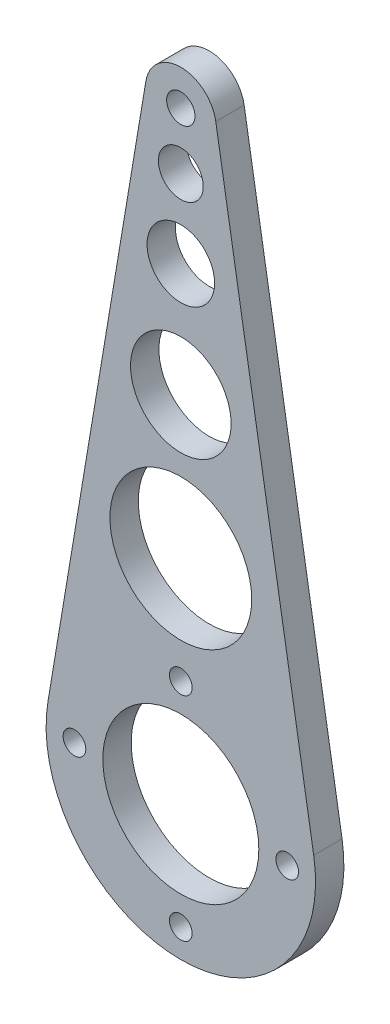
ISO-10303-21;
HEADER;
FILE_DESCRIPTION(('STEP AP214'),'2;1');
FILE_NAME('part.step','',(''),(''),'','','');
FILE_SCHEMA(('AUTOMOTIVE_DESIGN { 1 0 10303 214 1 1 1 1 }'));
ENDSEC;
DATA;
#1=APPLICATION_CONTEXT('core data for automotive mechanical design processes');
#2=APPLICATION_PROTOCOL_DEFINITION('international standard','automotive_design',2000,#1);
#3=PRODUCT_CONTEXT('',#1,'mechanical');
#4=PRODUCT('Part','Part','',(#3));
#5=PRODUCT_RELATED_PRODUCT_CATEGORY('part','',(#4));
#6=PRODUCT_DEFINITION_FORMATION('','',#4);
#7=PRODUCT_DEFINITION_CONTEXT('part definition',#1,'design');
#8=PRODUCT_DEFINITION('design','',#6,#7);
#9=PRODUCT_DEFINITION_SHAPE('','',#8);
#10=(LENGTH_UNIT() NAMED_UNIT(*) SI_UNIT(.MILLI.,.METRE.));
#11=(NAMED_UNIT(*) PLANE_ANGLE_UNIT() SI_UNIT($,.RADIAN.));
#12=(NAMED_UNIT(*) SI_UNIT($,.STERADIAN.) SOLID_ANGLE_UNIT());
#13=UNCERTAINTY_MEASURE_WITH_UNIT(LENGTH_MEASURE(1.E-05),#10,'distance_accuracy_value','');
#14=(GEOMETRIC_REPRESENTATION_CONTEXT(3) GLOBAL_UNCERTAINTY_ASSIGNED_CONTEXT((#13)) GLOBAL_UNIT_ASSIGNED_CONTEXT((#10,
#11,#12)) REPRESENTATION_CONTEXT('',''));
#15=CARTESIAN_POINT('',(0.,0.,0.));
#16=DIRECTION('',(0.,0.,1.));
#17=DIRECTION('',(1.,0.,0.));
#18=AXIS2_PLACEMENT_3D('',#15,#16,#17);
#19=CARTESIAN_POINT('',(0.,0.,4.));
#20=DIRECTION('',(0.,0.,1.));
#21=DIRECTION('',(1.,0.,0.));
#22=AXIS2_PLACEMENT_3D('',#19,#20,#21);
#23=PLANE('',#22);
#24=CARTESIAN_POINT('',(0.,50.,4.));
#25=DIRECTION('',(0.,0.,1.));
#26=DIRECTION('',(1.,0.,0.));
#27=AXIS2_PLACEMENT_3D('',#24,#25,#26);
#28=CIRCLE('',#27,7.09090909090909);
#29=CARTESIAN_POINT('',(7.09090909090909,50.,4.));
#30=VERTEX_POINT('',#29);
#31=EDGE_CURVE('E157',#30,#30,#28,.T.);
#32=ORIENTED_EDGE('',*,*,#31,.F.);
#33=EDGE_LOOP('',(#32));
#34=FACE_BOUND('',#33,.T.);
#35=CARTESIAN_POINT('',(0.,77.,4.));
#36=DIRECTION('',(0.,0.,1.));
#37=DIRECTION('',(1.,0.,0.));
#38=AXIS2_PLACEMENT_3D('',#35,#36,#37);
#39=CIRCLE('',#38,3.16363636363636);
#40=CARTESIAN_POINT('',(3.16363636363636,77.,4.));
#41=VERTEX_POINT('',#40);
#42=EDGE_CURVE('E145',#41,#41,#39,.T.);
#43=ORIENTED_EDGE('',*,*,#42,.F.);
#44=EDGE_LOOP('',(#43));
#45=FACE_BOUND('',#44,.T.);
#46=CARTESIAN_POINT('',(8.48977342514678E-13,-15.,4.));
#47=DIRECTION('',(0.,0.,1.));
#48=DIRECTION('',(1.,0.,0.));
#49=AXIS2_PLACEMENT_3D('',#46,#47,#48);
#50=CIRCLE('',#49,1.60000000000091);
#51=CARTESIAN_POINT('',(1.60000000000176,-15.,4.));
#52=VERTEX_POINT('',#51);
#53=EDGE_CURVE('E133',#52,#52,#50,.T.);
#54=ORIENTED_EDGE('',*,*,#53,.F.);
#55=EDGE_LOOP('',(#54));
#56=FACE_BOUND('',#55,.T.);
#57=CARTESIAN_POINT('',(0.,85.,4.));
#58=DIRECTION('',(0.,0.,1.));
#59=DIRECTION('',(1.,0.,0.));
#60=AXIS2_PLACEMENT_3D('',#57,#58,#59);
#61=CIRCLE('',#60,2.);
#62=CARTESIAN_POINT('',(2.,85.,4.));
#63=VERTEX_POINT('',#62);
#64=EDGE_CURVE('E121',#63,#63,#61,.T.);
#65=ORIENTED_EDGE('',*,*,#64,.F.);
#66=EDGE_LOOP('',(#65));
#67=FACE_BOUND('',#66,.T.);
#68=CARTESIAN_POINT('',(0.,15.,4.));
#69=DIRECTION('',(0.,0.,1.));
#70=DIRECTION('',(1.,0.,0.));
#71=AXIS2_PLACEMENT_3D('',#68,#69,#70);
#72=CIRCLE('',#71,1.6);
#73=CARTESIAN_POINT('',(1.6,15.,4.));
#74=VERTEX_POINT('',#73);
#75=EDGE_CURVE('E100',#74,#74,#72,.T.);
#76=ORIENTED_EDGE('',*,*,#75,.F.);
#77=EDGE_LOOP('',(#76));
#78=FACE_BOUND('',#77,.T.);
#79=CARTESIAN_POINT('',(0.,0.,4.));
#80=DIRECTION('',(0.,0.,1.));
#81=DIRECTION('',(1.,0.,0.));
#82=AXIS2_PLACEMENT_3D('',#79,#80,#81);
#83=CIRCLE('',#82,19.);
#84=CARTESIAN_POINT('',(-18.7405117861525,3.12941176470588,4.));
#85=VERTEX_POINT('',#84);
#86=CARTESIAN_POINT('',(18.7405117861525,3.12941176470588,4.));
#87=VERTEX_POINT('',#86);
#88=EDGE_CURVE('E85',#85,#87,#83,.T.);
#89=ORIENTED_EDGE('',*,*,#88,.T.);
#90=DIRECTION('',(-0.164705882352941,0.986342725586973,0.));
#91=VECTOR('',#90,1.);
#92=CARTESIAN_POINT('',(18.7405117861525,3.12941176470588,4.));
#93=LINE('',#92,#91);
#94=CARTESIAN_POINT('',(4.93171362793486,85.8235294117647,4.));
#95=VERTEX_POINT('',#94);
#96=EDGE_CURVE('E80',#87,#95,#93,.T.);
#97=ORIENTED_EDGE('',*,*,#96,.T.);
#98=CARTESIAN_POINT('',(0.,85.,4.));
#99=DIRECTION('',(0.,0.,1.));
#100=DIRECTION('',(1.,0.,0.));
#101=AXIS2_PLACEMENT_3D('',#98,#99,#100);
#102=CIRCLE('',#101,5.);
#103=CARTESIAN_POINT('',(-4.93171362793486,85.8235294117647,4.));
#104=VERTEX_POINT('',#103);
#105=EDGE_CURVE('E83',#95,#104,#102,.T.);
#106=ORIENTED_EDGE('',*,*,#105,.T.);
#107=DIRECTION('',(-0.164705882352941,-0.986342725586973,0.));
#108=VECTOR('',#107,1.);
#109=CARTESIAN_POINT('',(-18.7405117861525,3.12941176470588,4.));
#110=LINE('',#109,#108);
#111=EDGE_CURVE('E50',#104,#85,#110,.T.);
#112=ORIENTED_EDGE('',*,*,#111,.T.);
#113=EDGE_LOOP('',(#89,#97,#106,#112));
#114=FACE_BOUND('',#113,.T.);
#115=CARTESIAN_POINT('',(0.,0.,4.));
#116=DIRECTION('',(0.,0.,1.));
#117=DIRECTION('',(1.,0.,0.));
#118=AXIS2_PLACEMENT_3D('',#115,#116,#117);
#119=CIRCLE('',#118,11.);
#120=CARTESIAN_POINT('',(11.,0.,4.));
#121=VERTEX_POINT('',#120);
#122=EDGE_CURVE('E115',#121,#121,#119,.T.);
#123=ORIENTED_EDGE('',*,*,#122,.F.);
#124=EDGE_LOOP('',(#123));
#125=FACE_BOUND('',#124,.T.);
#126=CARTESIAN_POINT('',(15.0000000000004,4.24488671257339E-13,4.));
#127=DIRECTION('',(0.,0.,1.));
#128=DIRECTION('',(1.,0.,0.));
#129=AXIS2_PLACEMENT_3D('',#126,#127,#128);
#130=CIRCLE('',#129,1.60000000000033);
#131=CARTESIAN_POINT('',(16.6000000000008,4.24488671257339E-13,4.));
#132=VERTEX_POINT('',#131);
#133=EDGE_CURVE('E127',#132,#132,#130,.T.);
#134=ORIENTED_EDGE('',*,*,#133,.F.);
#135=EDGE_LOOP('',(#134));
#136=FACE_BOUND('',#135,.T.);
#137=CARTESIAN_POINT('',(-14.9999999999996,-4.2632564145606E-13,4.));
#138=DIRECTION('',(0.,0.,1.));
#139=DIRECTION('',(1.,0.,0.));
#140=AXIS2_PLACEMENT_3D('',#137,#138,#139);
#141=CIRCLE('',#140,1.60000000000068);
#142=CARTESIAN_POINT('',(-13.3999999999989,-4.2632564145606E-13,4.));
#143=VERTEX_POINT('',#142);
#144=EDGE_CURVE('E139',#143,#143,#141,.T.);
#145=ORIENTED_EDGE('',*,*,#144,.F.);
#146=EDGE_LOOP('',(#145));
#147=FACE_BOUND('',#146,.T.);
#148=CARTESIAN_POINT('',(0.,30.,4.));
#149=DIRECTION('',(0.,0.,1.));
#150=DIRECTION('',(1.,0.,0.));
#151=AXIS2_PLACEMENT_3D('',#148,#149,#150);
#152=CIRCLE('',#151,10.);
#153=CARTESIAN_POINT('',(10.,30.,4.));
#154=VERTEX_POINT('',#153);
#155=EDGE_CURVE('E151',#154,#154,#152,.T.);
#156=ORIENTED_EDGE('',*,*,#155,.F.);
#157=EDGE_LOOP('',(#156));
#158=FACE_BOUND('',#157,.T.);
#159=CARTESIAN_POINT('',(0.,66.,4.));
#160=DIRECTION('',(0.,0.,1.));
#161=DIRECTION('',(1.,0.,0.));
#162=AXIS2_PLACEMENT_3D('',#159,#160,#161);
#163=CIRCLE('',#162,4.76363636363637);
#164=CARTESIAN_POINT('',(4.76363636363637,66.,4.));
#165=VERTEX_POINT('',#164);
#166=EDGE_CURVE('E163',#165,#165,#163,.T.);
#167=ORIENTED_EDGE('',*,*,#166,.F.);
#168=EDGE_LOOP('',(#167));
#169=FACE_BOUND('',#168,.T.);
#170=ADVANCED_FACE('F33',(#34,#45,#56,#67,#78,#114,#125,#136,#147,#158,#169),#23,.T.);
#171=CARTESIAN_POINT('',(0.,0.,0.));
#172=DIRECTION('',(0.,0.,1.));
#173=DIRECTION('',(1.,0.,0.));
#174=AXIS2_PLACEMENT_3D('',#171,#172,#173);
#175=PLANE('',#174);
#176=CARTESIAN_POINT('',(0.,0.,0.));
#177=DIRECTION('',(0.,0.,1.));
#178=DIRECTION('',(1.,0.,0.));
#179=AXIS2_PLACEMENT_3D('',#176,#177,#178);
#180=CIRCLE('',#179,19.);
#181=CARTESIAN_POINT('',(-18.7405117861525,3.12941176470588,0.));
#182=VERTEX_POINT('',#181);
#183=CARTESIAN_POINT('',(18.7405117861525,3.12941176470588,0.));
#184=VERTEX_POINT('',#183);
#185=EDGE_CURVE('E97',#182,#184,#180,.T.);
#186=ORIENTED_EDGE('',*,*,#185,.F.);
#187=DIRECTION('',(-0.164705882352941,-0.986342725586973,0.));
#188=VECTOR('',#187,1.);
#189=CARTESIAN_POINT('',(-18.7405117861525,3.12941176470588,0.));
#190=LINE('',#189,#188);
#191=CARTESIAN_POINT('',(-4.93171362793486,85.8235294117647,0.));
#192=VERTEX_POINT('',#191);
#193=EDGE_CURVE('E73',#192,#182,#190,.T.);
#194=ORIENTED_EDGE('',*,*,#193,.F.);
#195=CARTESIAN_POINT('',(0.,85.,0.));
#196=DIRECTION('',(0.,0.,1.));
#197=DIRECTION('',(1.,0.,0.));
#198=AXIS2_PLACEMENT_3D('',#195,#196,#197);
#199=CIRCLE('',#198,5.);
#200=CARTESIAN_POINT('',(4.93171362793486,85.8235294117647,0.));
#201=VERTEX_POINT('',#200);
#202=EDGE_CURVE('E67',#201,#192,#199,.T.);
#203=ORIENTED_EDGE('',*,*,#202,.F.);
#204=DIRECTION('',(-0.164705882352941,0.986342725586973,0.));
#205=VECTOR('',#204,1.);
#206=CARTESIAN_POINT('',(18.7405117861525,3.12941176470588,0.));
#207=LINE('',#206,#205);
#208=EDGE_CURVE('E89',#184,#201,#207,.T.);
#209=ORIENTED_EDGE('',*,*,#208,.F.);
#210=EDGE_LOOP('',(#186,#194,#203,#209));
#211=FACE_BOUND('',#210,.T.);
#212=CARTESIAN_POINT('',(0.,15.,0.));
#213=DIRECTION('',(0.,0.,1.));
#214=DIRECTION('',(1.,0.,0.));
#215=AXIS2_PLACEMENT_3D('',#212,#213,#214);
#216=CIRCLE('',#215,1.6);
#217=CARTESIAN_POINT('',(1.6,15.,0.));
#218=VERTEX_POINT('',#217);
#219=EDGE_CURVE('E112',#218,#218,#216,.T.);
#220=ORIENTED_EDGE('',*,*,#219,.T.);
#221=EDGE_LOOP('',(#220));
#222=FACE_BOUND('',#221,.T.);
#223=CARTESIAN_POINT('',(0.,0.,0.));
#224=DIRECTION('',(0.,0.,1.));
#225=DIRECTION('',(1.,0.,0.));
#226=AXIS2_PLACEMENT_3D('',#223,#224,#225);
#227=CIRCLE('',#226,11.);
#228=CARTESIAN_POINT('',(11.,0.,0.));
#229=VERTEX_POINT('',#228);
#230=EDGE_CURVE('E118',#229,#229,#227,.T.);
#231=ORIENTED_EDGE('',*,*,#230,.T.);
#232=EDGE_LOOP('',(#231));
#233=FACE_BOUND('',#232,.T.);
#234=CARTESIAN_POINT('',(0.,85.,0.));
#235=DIRECTION('',(0.,0.,1.));
#236=DIRECTION('',(1.,0.,0.));
#237=AXIS2_PLACEMENT_3D('',#234,#235,#236);
#238=CIRCLE('',#237,2.);
#239=CARTESIAN_POINT('',(2.,85.,0.));
#240=VERTEX_POINT('',#239);
#241=EDGE_CURVE('E124',#240,#240,#238,.T.);
#242=ORIENTED_EDGE('',*,*,#241,.T.);
#243=EDGE_LOOP('',(#242));
#244=FACE_BOUND('',#243,.T.);
#245=CARTESIAN_POINT('',(15.0000000000004,4.24488671257339E-13,0.));
#246=DIRECTION('',(0.,0.,1.));
#247=DIRECTION('',(1.,0.,0.));
#248=AXIS2_PLACEMENT_3D('',#245,#246,#247);
#249=CIRCLE('',#248,1.60000000000033);
#250=CARTESIAN_POINT('',(16.6000000000008,4.24488671257339E-13,0.));
#251=VERTEX_POINT('',#250);
#252=EDGE_CURVE('E130',#251,#251,#249,.T.);
#253=ORIENTED_EDGE('',*,*,#252,.T.);
#254=EDGE_LOOP('',(#253));
#255=FACE_BOUND('',#254,.T.);
#256=CARTESIAN_POINT('',(8.48977342514678E-13,-15.,0.));
#257=DIRECTION('',(0.,0.,1.));
#258=DIRECTION('',(1.,0.,0.));
#259=AXIS2_PLACEMENT_3D('',#256,#257,#258);
#260=CIRCLE('',#259,1.60000000000091);
#261=CARTESIAN_POINT('',(1.60000000000176,-15.,0.));
#262=VERTEX_POINT('',#261);
#263=EDGE_CURVE('E136',#262,#262,#260,.T.);
#264=ORIENTED_EDGE('',*,*,#263,.T.);
#265=EDGE_LOOP('',(#264));
#266=FACE_BOUND('',#265,.T.);
#267=CARTESIAN_POINT('',(-14.9999999999996,-4.2632564145606E-13,0.));
#268=DIRECTION('',(0.,0.,1.));
#269=DIRECTION('',(1.,0.,0.));
#270=AXIS2_PLACEMENT_3D('',#267,#268,#269);
#271=CIRCLE('',#270,1.60000000000068);
#272=CARTESIAN_POINT('',(-13.3999999999989,-4.2632564145606E-13,0.));
#273=VERTEX_POINT('',#272);
#274=EDGE_CURVE('E142',#273,#273,#271,.T.);
#275=ORIENTED_EDGE('',*,*,#274,.T.);
#276=EDGE_LOOP('',(#275));
#277=FACE_BOUND('',#276,.T.);
#278=CARTESIAN_POINT('',(0.,77.,0.));
#279=DIRECTION('',(0.,0.,1.));
#280=DIRECTION('',(1.,0.,0.));
#281=AXIS2_PLACEMENT_3D('',#278,#279,#280);
#282=CIRCLE('',#281,3.16363636363636);
#283=CARTESIAN_POINT('',(3.16363636363636,77.,0.));
#284=VERTEX_POINT('',#283);
#285=EDGE_CURVE('E148',#284,#284,#282,.T.);
#286=ORIENTED_EDGE('',*,*,#285,.T.);
#287=EDGE_LOOP('',(#286));
#288=FACE_BOUND('',#287,.T.);
#289=CARTESIAN_POINT('',(0.,30.,0.));
#290=DIRECTION('',(0.,0.,1.));
#291=DIRECTION('',(1.,0.,0.));
#292=AXIS2_PLACEMENT_3D('',#289,#290,#291);
#293=CIRCLE('',#292,10.);
#294=CARTESIAN_POINT('',(10.,30.,0.));
#295=VERTEX_POINT('',#294);
#296=EDGE_CURVE('E154',#295,#295,#293,.T.);
#297=ORIENTED_EDGE('',*,*,#296,.T.);
#298=EDGE_LOOP('',(#297));
#299=FACE_BOUND('',#298,.T.);
#300=CARTESIAN_POINT('',(0.,50.,0.));
#301=DIRECTION('',(0.,0.,1.));
#302=DIRECTION('',(1.,0.,0.));
#303=AXIS2_PLACEMENT_3D('',#300,#301,#302);
#304=CIRCLE('',#303,7.09090909090909);
#305=CARTESIAN_POINT('',(7.09090909090909,50.,0.));
#306=VERTEX_POINT('',#305);
#307=EDGE_CURVE('E160',#306,#306,#304,.T.);
#308=ORIENTED_EDGE('',*,*,#307,.T.);
#309=EDGE_LOOP('',(#308));
#310=FACE_BOUND('',#309,.T.);
#311=CARTESIAN_POINT('',(0.,66.,0.));
#312=DIRECTION('',(0.,0.,1.));
#313=DIRECTION('',(1.,0.,0.));
#314=AXIS2_PLACEMENT_3D('',#311,#312,#313);
#315=CIRCLE('',#314,4.76363636363637);
#316=CARTESIAN_POINT('',(4.76363636363637,66.,0.));
#317=VERTEX_POINT('',#316);
#318=EDGE_CURVE('E166',#317,#317,#315,.T.);
#319=ORIENTED_EDGE('',*,*,#318,.T.);
#320=EDGE_LOOP('',(#319));
#321=FACE_BOUND('',#320,.T.);
#322=ADVANCED_FACE('F108',(#211,#222,#233,#244,#255,#266,#277,#288,#299,#310,#321),#175,.F.);
#323=CARTESIAN_POINT('',(0.,0.,4.));
#324=DIRECTION('',(0.,0.,-1.));
#325=DIRECTION('',(-1.,0.,0.));
#326=AXIS2_PLACEMENT_3D('',#323,#324,#325);
#327=CYLINDRICAL_SURFACE('',#326,19.);
#328=ORIENTED_EDGE('',*,*,#185,.T.);
#329=DIRECTION('',(0.,0.,-1.));
#330=VECTOR('',#329,1.);
#331=CARTESIAN_POINT('',(18.7405117861525,3.12941176470588,4.));
#332=LINE('',#331,#330);
#333=EDGE_CURVE('E11',#87,#184,#332,.T.);
#334=ORIENTED_EDGE('',*,*,#333,.F.);
#335=ORIENTED_EDGE('',*,*,#88,.F.);
#336=DIRECTION('',(0.,0.,-1.));
#337=VECTOR('',#336,1.);
#338=CARTESIAN_POINT('',(-18.7405117861525,3.12941176470588,4.));
#339=LINE('',#338,#337);
#340=EDGE_CURVE('E93',#85,#182,#339,.T.);
#341=ORIENTED_EDGE('',*,*,#340,.T.);
#342=EDGE_LOOP('',(#328,#334,#335,#341));
#343=FACE_BOUND('',#342,.T.);
#344=ADVANCED_FACE('F35',(#343),#327,.T.);
#345=CARTESIAN_POINT('',(18.7405117861525,3.12941176470588,4.));
#346=DIRECTION('',(-0.986342725586973,-0.164705882352941,0.));
#347=DIRECTION('',(0.164705882352941,-0.986342725586973,0.));
#348=AXIS2_PLACEMENT_3D('',#345,#346,#347);
#349=PLANE('',#348);
#350=ORIENTED_EDGE('',*,*,#208,.T.);
#351=DIRECTION('',(0.,0.,-1.));
#352=VECTOR('',#351,1.);
#353=CARTESIAN_POINT('',(4.93171362793486,85.8235294117647,4.));
#354=LINE('',#353,#352);
#355=EDGE_CURVE('E42',#95,#201,#354,.T.);
#356=ORIENTED_EDGE('',*,*,#355,.F.);
#357=ORIENTED_EDGE('',*,*,#96,.F.);
#358=ORIENTED_EDGE('',*,*,#333,.T.);
#359=EDGE_LOOP('',(#350,#356,#357,#358));
#360=FACE_BOUND('',#359,.T.);
#361=ADVANCED_FACE('F88',(#360),#349,.F.);
#362=CARTESIAN_POINT('',(0.,85.,4.));
#363=DIRECTION('',(0.,0.,-1.));
#364=DIRECTION('',(-1.,0.,0.));
#365=AXIS2_PLACEMENT_3D('',#362,#363,#364);
#366=CYLINDRICAL_SURFACE('',#365,5.);
#367=ORIENTED_EDGE('',*,*,#202,.T.);
#368=DIRECTION('',(0.,0.,-1.));
#369=VECTOR('',#368,1.);
#370=CARTESIAN_POINT('',(-4.93171362793486,85.8235294117647,4.));
#371=LINE('',#370,#369);
#372=EDGE_CURVE('E90',#104,#192,#371,.T.);
#373=ORIENTED_EDGE('',*,*,#372,.F.);
#374=ORIENTED_EDGE('',*,*,#105,.F.);
#375=ORIENTED_EDGE('',*,*,#355,.T.);
#376=EDGE_LOOP('',(#367,#373,#374,#375));
#377=FACE_BOUND('',#376,.T.);
#378=ADVANCED_FACE('F91',(#377),#366,.T.);
#379=CARTESIAN_POINT('',(-18.7405117861525,3.12941176470588,4.));
#380=DIRECTION('',(0.986342725586973,-0.164705882352941,0.));
#381=DIRECTION('',(0.164705882352941,0.986342725586973,0.));
#382=AXIS2_PLACEMENT_3D('',#379,#380,#381);
#383=PLANE('',#382);
#384=ORIENTED_EDGE('',*,*,#193,.T.);
#385=ORIENTED_EDGE('',*,*,#340,.F.);
#386=ORIENTED_EDGE('',*,*,#111,.F.);
#387=ORIENTED_EDGE('',*,*,#372,.T.);
#388=EDGE_LOOP('',(#384,#385,#386,#387));
#389=FACE_BOUND('',#388,.T.);
#390=ADVANCED_FACE('F105',(#389),#383,.F.);
#391=CARTESIAN_POINT('',(0.,15.,4.));
#392=DIRECTION('',(0.,0.,-1.));
#393=DIRECTION('',(-1.,0.,0.));
#394=AXIS2_PLACEMENT_3D('',#391,#392,#393);
#395=CYLINDRICAL_SURFACE('',#394,1.6);
#396=ORIENTED_EDGE('',*,*,#75,.T.);
#397=EDGE_LOOP('',(#396));
#398=FACE_BOUND('',#397,.T.);
#399=ORIENTED_EDGE('',*,*,#219,.F.);
#400=EDGE_LOOP('',(#399));
#401=FACE_BOUND('',#400,.T.);
#402=ADVANCED_FACE('F185',(#398,#401),#395,.F.);
#403=CARTESIAN_POINT('',(0.,0.,4.));
#404=DIRECTION('',(0.,0.,-1.));
#405=DIRECTION('',(-1.,0.,0.));
#406=AXIS2_PLACEMENT_3D('',#403,#404,#405);
#407=CYLINDRICAL_SURFACE('',#406,11.);
#408=ORIENTED_EDGE('',*,*,#122,.T.);
#409=EDGE_LOOP('',(#408));
#410=FACE_BOUND('',#409,.T.);
#411=ORIENTED_EDGE('',*,*,#230,.F.);
#412=EDGE_LOOP('',(#411));
#413=FACE_BOUND('',#412,.T.);
#414=ADVANCED_FACE('F231',(#410,#413),#407,.F.);
#415=CARTESIAN_POINT('',(0.,85.,4.));
#416=DIRECTION('',(0.,0.,-1.));
#417=DIRECTION('',(-1.,0.,0.));
#418=AXIS2_PLACEMENT_3D('',#415,#416,#417);
#419=CYLINDRICAL_SURFACE('',#418,2.);
#420=ORIENTED_EDGE('',*,*,#64,.T.);
#421=EDGE_LOOP('',(#420));
#422=FACE_BOUND('',#421,.T.);
#423=ORIENTED_EDGE('',*,*,#241,.F.);
#424=EDGE_LOOP('',(#423));
#425=FACE_BOUND('',#424,.T.);
#426=ADVANCED_FACE('F239',(#422,#425),#419,.F.);
#427=CARTESIAN_POINT('',(15.0000000000004,4.24488671257339E-13,4.));
#428=DIRECTION('',(0.,0.,-1.));
#429=DIRECTION('',(-1.,0.,0.));
#430=AXIS2_PLACEMENT_3D('',#427,#428,#429);
#431=CYLINDRICAL_SURFACE('',#430,1.60000000000033);
#432=ORIENTED_EDGE('',*,*,#133,.T.);
#433=EDGE_LOOP('',(#432));
#434=FACE_BOUND('',#433,.T.);
#435=ORIENTED_EDGE('',*,*,#252,.F.);
#436=EDGE_LOOP('',(#435));
#437=FACE_BOUND('',#436,.T.);
#438=ADVANCED_FACE('F247',(#434,#437),#431,.F.);
#439=CARTESIAN_POINT('',(8.48977342514678E-13,-15.,4.));
#440=DIRECTION('',(0.,0.,-1.));
#441=DIRECTION('',(-1.,0.,0.));
#442=AXIS2_PLACEMENT_3D('',#439,#440,#441);
#443=CYLINDRICAL_SURFACE('',#442,1.60000000000091);
#444=ORIENTED_EDGE('',*,*,#53,.T.);
#445=EDGE_LOOP('',(#444));
#446=FACE_BOUND('',#445,.T.);
#447=ORIENTED_EDGE('',*,*,#263,.F.);
#448=EDGE_LOOP('',(#447));
#449=FACE_BOUND('',#448,.T.);
#450=ADVANCED_FACE('F256',(#446,#449),#443,.F.);
#451=CARTESIAN_POINT('',(-14.9999999999996,-4.2632564145606E-13,4.));
#452=DIRECTION('',(0.,0.,-1.));
#453=DIRECTION('',(-1.,0.,0.));
#454=AXIS2_PLACEMENT_3D('',#451,#452,#453);
#455=CYLINDRICAL_SURFACE('',#454,1.60000000000068);
#456=ORIENTED_EDGE('',*,*,#144,.T.);
#457=EDGE_LOOP('',(#456));
#458=FACE_BOUND('',#457,.T.);
#459=ORIENTED_EDGE('',*,*,#274,.F.);
#460=EDGE_LOOP('',(#459));
#461=FACE_BOUND('',#460,.T.);
#462=ADVANCED_FACE('F265',(#458,#461),#455,.F.);
#463=CARTESIAN_POINT('',(0.,77.,4.));
#464=DIRECTION('',(0.,0.,-1.));
#465=DIRECTION('',(-1.,0.,0.));
#466=AXIS2_PLACEMENT_3D('',#463,#464,#465);
#467=CYLINDRICAL_SURFACE('',#466,3.16363636363636);
#468=ORIENTED_EDGE('',*,*,#42,.T.);
#469=EDGE_LOOP('',(#468));
#470=FACE_BOUND('',#469,.T.);
#471=ORIENTED_EDGE('',*,*,#285,.F.);
#472=EDGE_LOOP('',(#471));
#473=FACE_BOUND('',#472,.T.);
#474=ADVANCED_FACE('F274',(#470,#473),#467,.F.);
#475=CARTESIAN_POINT('',(0.,30.,4.));
#476=DIRECTION('',(0.,0.,-1.));
#477=DIRECTION('',(-1.,0.,0.));
#478=AXIS2_PLACEMENT_3D('',#475,#476,#477);
#479=CYLINDRICAL_SURFACE('',#478,10.);
#480=ORIENTED_EDGE('',*,*,#155,.T.);
#481=EDGE_LOOP('',(#480));
#482=FACE_BOUND('',#481,.T.);
#483=ORIENTED_EDGE('',*,*,#296,.F.);
#484=EDGE_LOOP('',(#483));
#485=FACE_BOUND('',#484,.T.);
#486=ADVANCED_FACE('F283',(#482,#485),#479,.F.);
#487=CARTESIAN_POINT('',(0.,50.,4.));
#488=DIRECTION('',(0.,0.,-1.));
#489=DIRECTION('',(-1.,0.,0.));
#490=AXIS2_PLACEMENT_3D('',#487,#488,#489);
#491=CYLINDRICAL_SURFACE('',#490,7.09090909090909);
#492=ORIENTED_EDGE('',*,*,#31,.T.);
#493=EDGE_LOOP('',(#492));
#494=FACE_BOUND('',#493,.T.);
#495=ORIENTED_EDGE('',*,*,#307,.F.);
#496=EDGE_LOOP('',(#495));
#497=FACE_BOUND('',#496,.T.);
#498=ADVANCED_FACE('F292',(#494,#497),#491,.F.);
#499=CARTESIAN_POINT('',(0.,66.,4.));
#500=DIRECTION('',(0.,0.,-1.));
#501=DIRECTION('',(-1.,0.,0.));
#502=AXIS2_PLACEMENT_3D('',#499,#500,#501);
#503=CYLINDRICAL_SURFACE('',#502,4.76363636363637);
#504=ORIENTED_EDGE('',*,*,#166,.T.);
#505=EDGE_LOOP('',(#504));
#506=FACE_BOUND('',#505,.T.);
#507=ORIENTED_EDGE('',*,*,#318,.F.);
#508=EDGE_LOOP('',(#507));
#509=FACE_BOUND('',#508,.T.);
#510=ADVANCED_FACE('F172',(#506,#509),#503,.F.);
#511=CLOSED_SHELL('',(#170,#322,#344,#361,#378,#390,#402,#414,#426,#438,#450,#462,#474,#486,
#498,#510));
#512=MANIFOLD_SOLID_BREP('B2',#511);
#513=ADVANCED_BREP_SHAPE_REPRESENTATION('',(#18,#512),#14);
#514=SHAPE_DEFINITION_REPRESENTATION(#9,#513);
ENDSEC;
END-ISO-10303-21;
